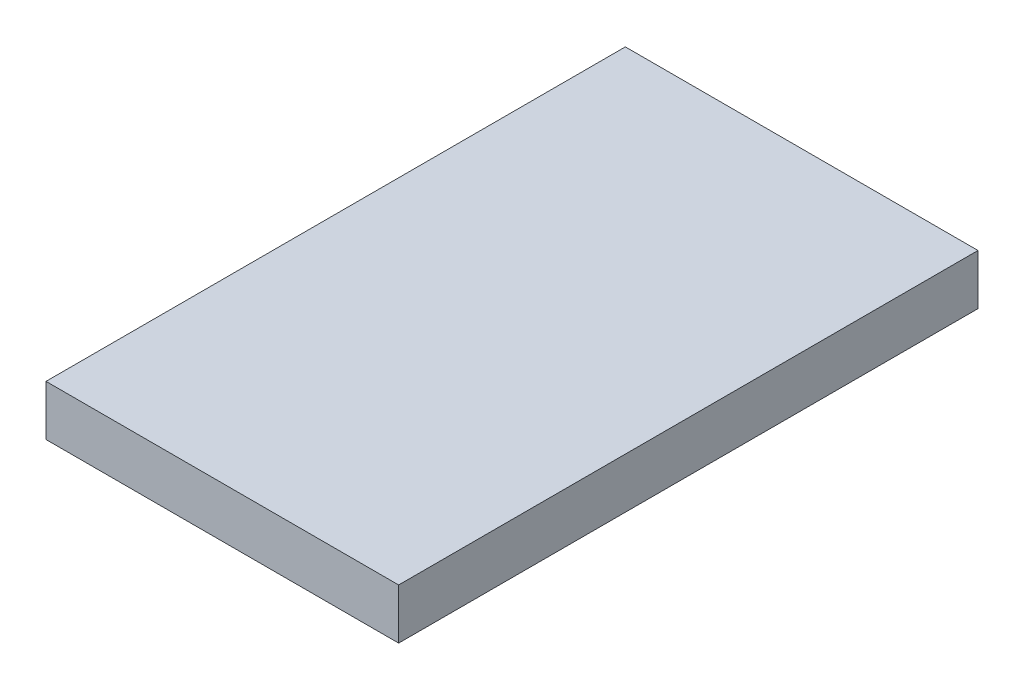
ISO-10303-21;
HEADER;
FILE_DESCRIPTION(('STEP AP214'),'2;1');
FILE_NAME('part.step','',(''),(''),'','','');
FILE_SCHEMA(('AUTOMOTIVE_DESIGN { 1 0 10303 214 1 1 1 1 }'));
ENDSEC;
DATA;
#1=APPLICATION_CONTEXT('core data for automotive mechanical design processes');
#2=APPLICATION_PROTOCOL_DEFINITION('international standard','automotive_design',2000,#1);
#3=PRODUCT_CONTEXT('',#1,'mechanical');
#4=PRODUCT('Part','Part','',(#3));
#5=PRODUCT_RELATED_PRODUCT_CATEGORY('part','',(#4));
#6=PRODUCT_DEFINITION_FORMATION('','',#4);
#7=PRODUCT_DEFINITION_CONTEXT('part definition',#1,'design');
#8=PRODUCT_DEFINITION('design','',#6,#7);
#9=PRODUCT_DEFINITION_SHAPE('','',#8);
#10=(LENGTH_UNIT() NAMED_UNIT(*) SI_UNIT(.MILLI.,.METRE.));
#11=(NAMED_UNIT(*) PLANE_ANGLE_UNIT() SI_UNIT($,.RADIAN.));
#12=(NAMED_UNIT(*) SI_UNIT($,.STERADIAN.) SOLID_ANGLE_UNIT());
#13=UNCERTAINTY_MEASURE_WITH_UNIT(LENGTH_MEASURE(1.E-05),#10,'distance_accuracy_value','');
#14=(GEOMETRIC_REPRESENTATION_CONTEXT(3) GLOBAL_UNCERTAINTY_ASSIGNED_CONTEXT((#13)) GLOBAL_UNIT_ASSIGNED_CONTEXT((#10,
#11,#12)) REPRESENTATION_CONTEXT('',''));
#15=CARTESIAN_POINT('',(0.,0.,0.));
#16=DIRECTION('',(0.,0.,1.));
#17=DIRECTION('',(1.,0.,0.));
#18=AXIS2_PLACEMENT_3D('',#15,#16,#17);
#19=CARTESIAN_POINT('',(0.,2.,0.));
#20=DIRECTION('',(1.,0.,0.));
#21=DIRECTION('',(0.,0.,-1.));
#22=AXIS2_PLACEMENT_3D('',#19,#20,#21);
#23=PLANE('',#22);
#24=DIRECTION('',(0.,0.,1.));
#25=VECTOR('',#24,1.);
#26=CARTESIAN_POINT('',(0.,0.,0.));
#27=LINE('',#26,#25);
#28=CARTESIAN_POINT('',(0.,0.,-23.));
#29=VERTEX_POINT('',#28);
#30=CARTESIAN_POINT('',(0.,0.,0.));
#31=VERTEX_POINT('',#30);
#32=EDGE_CURVE('E100',#29,#31,#27,.T.);
#33=ORIENTED_EDGE('',*,*,#32,.T.);
#34=DIRECTION('',(0.,-1.,0.));
#35=VECTOR('',#34,1.);
#36=CARTESIAN_POINT('',(0.,2.,0.));
#37=LINE('',#36,#35);
#38=CARTESIAN_POINT('',(0.,2.,0.));
#39=VERTEX_POINT('',#38);
#40=EDGE_CURVE('E11',#39,#31,#37,.T.);
#41=ORIENTED_EDGE('',*,*,#40,.F.);
#42=DIRECTION('',(0.,0.,1.));
#43=VECTOR('',#42,1.);
#44=CARTESIAN_POINT('',(0.,2.,0.));
#45=LINE('',#44,#43);
#46=CARTESIAN_POINT('',(0.,2.,-23.));
#47=VERTEX_POINT('',#46);
#48=EDGE_CURVE('E88',#47,#39,#45,.T.);
#49=ORIENTED_EDGE('',*,*,#48,.F.);
#50=DIRECTION('',(0.,-1.,0.));
#51=VECTOR('',#50,1.);
#52=CARTESIAN_POINT('',(0.,2.,-23.));
#53=LINE('',#52,#51);
#54=EDGE_CURVE('E96',#47,#29,#53,.T.);
#55=ORIENTED_EDGE('',*,*,#54,.T.);
#56=EDGE_LOOP('',(#33,#41,#49,#55));
#57=FACE_BOUND('',#56,.T.);
#58=ADVANCED_FACE('F37',(#57),#23,.F.);
#59=CARTESIAN_POINT('',(0.,2.,0.));
#60=DIRECTION('',(0.,0.,-1.));
#61=DIRECTION('',(-1.,0.,0.));
#62=AXIS2_PLACEMENT_3D('',#59,#60,#61);
#63=PLANE('',#62);
#64=DIRECTION('',(1.,0.,0.));
#65=VECTOR('',#64,1.);
#66=CARTESIAN_POINT('',(0.,0.,0.));
#67=LINE('',#66,#65);
#68=CARTESIAN_POINT('',(14.,0.,0.));
#69=VERTEX_POINT('',#68);
#70=EDGE_CURVE('E92',#31,#69,#67,.T.);
#71=ORIENTED_EDGE('',*,*,#70,.T.);
#72=DIRECTION('',(0.,-1.,0.));
#73=VECTOR('',#72,1.);
#74=CARTESIAN_POINT('',(14.,2.,0.));
#75=LINE('',#74,#73);
#76=CARTESIAN_POINT('',(14.,2.,0.));
#77=VERTEX_POINT('',#76);
#78=EDGE_CURVE('E45',#77,#69,#75,.T.);
#79=ORIENTED_EDGE('',*,*,#78,.F.);
#80=DIRECTION('',(1.,0.,0.));
#81=VECTOR('',#80,1.);
#82=CARTESIAN_POINT('',(0.,2.,0.));
#83=LINE('',#82,#81);
#84=EDGE_CURVE('E83',#39,#77,#83,.T.);
#85=ORIENTED_EDGE('',*,*,#84,.F.);
#86=ORIENTED_EDGE('',*,*,#40,.T.);
#87=EDGE_LOOP('',(#71,#79,#85,#86));
#88=FACE_BOUND('',#87,.T.);
#89=ADVANCED_FACE('F91',(#88),#63,.F.);
#90=CARTESIAN_POINT('',(14.,2.,0.));
#91=DIRECTION('',(-1.,0.,0.));
#92=DIRECTION('',(0.,0.,1.));
#93=AXIS2_PLACEMENT_3D('',#90,#91,#92);
#94=PLANE('',#93);
#95=DIRECTION('',(0.,0.,-1.));
#96=VECTOR('',#95,1.);
#97=CARTESIAN_POINT('',(14.,0.,0.));
#98=LINE('',#97,#96);
#99=CARTESIAN_POINT('',(14.,0.,-23.));
#100=VERTEX_POINT('',#99);
#101=EDGE_CURVE('E70',#69,#100,#98,.T.);
#102=ORIENTED_EDGE('',*,*,#101,.T.);
#103=DIRECTION('',(0.,-1.,0.));
#104=VECTOR('',#103,1.);
#105=CARTESIAN_POINT('',(14.,2.,-23.));
#106=LINE('',#105,#104);
#107=CARTESIAN_POINT('',(14.,2.,-23.));
#108=VERTEX_POINT('',#107);
#109=EDGE_CURVE('E93',#108,#100,#106,.T.);
#110=ORIENTED_EDGE('',*,*,#109,.F.);
#111=DIRECTION('',(0.,0.,-1.));
#112=VECTOR('',#111,1.);
#113=CARTESIAN_POINT('',(14.,2.,0.));
#114=LINE('',#113,#112);
#115=EDGE_CURVE('E86',#77,#108,#114,.T.);
#116=ORIENTED_EDGE('',*,*,#115,.F.);
#117=ORIENTED_EDGE('',*,*,#78,.T.);
#118=EDGE_LOOP('',(#102,#110,#116,#117));
#119=FACE_BOUND('',#118,.T.);
#120=ADVANCED_FACE('F94',(#119),#94,.F.);
#121=CARTESIAN_POINT('',(0.,2.,-23.));
#122=DIRECTION('',(0.,0.,1.));
#123=DIRECTION('',(1.,0.,0.));
#124=AXIS2_PLACEMENT_3D('',#121,#122,#123);
#125=PLANE('',#124);
#126=DIRECTION('',(-1.,0.,0.));
#127=VECTOR('',#126,1.);
#128=CARTESIAN_POINT('',(0.,0.,-23.));
#129=LINE('',#128,#127);
#130=EDGE_CURVE('E76',#100,#29,#129,.T.);
#131=ORIENTED_EDGE('',*,*,#130,.T.);
#132=ORIENTED_EDGE('',*,*,#54,.F.);
#133=DIRECTION('',(-1.,0.,0.));
#134=VECTOR('',#133,1.);
#135=CARTESIAN_POINT('',(0.,2.,-23.));
#136=LINE('',#135,#134);
#137=EDGE_CURVE('E53',#108,#47,#136,.T.);
#138=ORIENTED_EDGE('',*,*,#137,.F.);
#139=ORIENTED_EDGE('',*,*,#109,.T.);
#140=EDGE_LOOP('',(#131,#132,#138,#139));
#141=FACE_BOUND('',#140,.T.);
#142=ADVANCED_FACE('F107',(#141),#125,.F.);
#143=CARTESIAN_POINT('',(0.,2.,0.));
#144=DIRECTION('',(0.,-1.,0.));
#145=DIRECTION('',(0.,0.,-1.));
#146=AXIS2_PLACEMENT_3D('',#143,#144,#145);
#147=PLANE('',#146);
#148=ORIENTED_EDGE('',*,*,#48,.T.);
#149=ORIENTED_EDGE('',*,*,#84,.T.);
#150=ORIENTED_EDGE('',*,*,#115,.T.);
#151=ORIENTED_EDGE('',*,*,#137,.T.);
#152=EDGE_LOOP('',(#148,#149,#150,#151));
#153=FACE_BOUND('',#152,.T.);
#154=ADVANCED_FACE('F84',(#153),#147,.F.);
#155=CARTESIAN_POINT('',(0.,0.,0.));
#156=DIRECTION('',(0.,-1.,0.));
#157=DIRECTION('',(0.,0.,-1.));
#158=AXIS2_PLACEMENT_3D('',#155,#156,#157);
#159=PLANE('',#158);
#160=ORIENTED_EDGE('',*,*,#32,.F.);
#161=ORIENTED_EDGE('',*,*,#130,.F.);
#162=ORIENTED_EDGE('',*,*,#101,.F.);
#163=ORIENTED_EDGE('',*,*,#70,.F.);
#164=EDGE_LOOP('',(#160,#161,#162,#163));
#165=FACE_BOUND('',#164,.T.);
#166=ADVANCED_FACE('F110',(#165),#159,.T.);
#167=CLOSED_SHELL('',(#58,#89,#120,#142,#154,#166));
#168=MANIFOLD_SOLID_BREP('B2',#167);
#169=ADVANCED_BREP_SHAPE_REPRESENTATION('',(#18,#168),#14);
#170=SHAPE_DEFINITION_REPRESENTATION(#9,#169);
ENDSEC;
END-ISO-10303-21;
